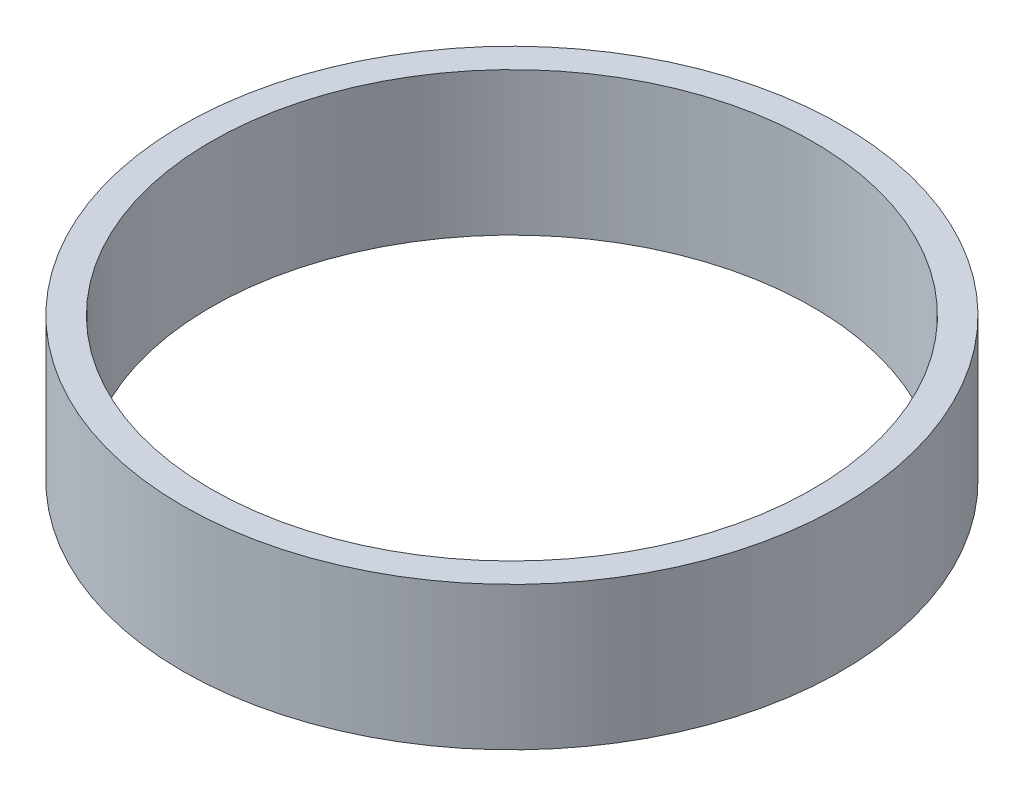
ISO-10303-21;
HEADER;
FILE_DESCRIPTION(('STEP AP214'),'2;1');
FILE_NAME('part.step','',(''),(''),'','','');
FILE_SCHEMA(('AUTOMOTIVE_DESIGN { 1 0 10303 214 1 1 1 1 }'));
ENDSEC;
DATA;
#1=APPLICATION_CONTEXT('core data for automotive mechanical design processes');
#2=APPLICATION_PROTOCOL_DEFINITION('international standard','automotive_design',2000,#1);
#3=PRODUCT_CONTEXT('',#1,'mechanical');
#4=PRODUCT('Part','Part','',(#3));
#5=PRODUCT_RELATED_PRODUCT_CATEGORY('part','',(#4));
#6=PRODUCT_DEFINITION_FORMATION('','',#4);
#7=PRODUCT_DEFINITION_CONTEXT('part definition',#1,'design');
#8=PRODUCT_DEFINITION('design','',#6,#7);
#9=PRODUCT_DEFINITION_SHAPE('','',#8);
#10=(LENGTH_UNIT() NAMED_UNIT(*) SI_UNIT(.MILLI.,.METRE.));
#11=(NAMED_UNIT(*) PLANE_ANGLE_UNIT() SI_UNIT($,.RADIAN.));
#12=(NAMED_UNIT(*) SI_UNIT($,.STERADIAN.) SOLID_ANGLE_UNIT());
#13=UNCERTAINTY_MEASURE_WITH_UNIT(LENGTH_MEASURE(1.E-05),#10,'distance_accuracy_value','');
#14=(GEOMETRIC_REPRESENTATION_CONTEXT(3) GLOBAL_UNCERTAINTY_ASSIGNED_CONTEXT((#13)) GLOBAL_UNIT_ASSIGNED_CONTEXT((#10,
#11,#12)) REPRESENTATION_CONTEXT('',''));
#15=CARTESIAN_POINT('',(0.,0.,0.));
#16=DIRECTION('',(0.,0.,1.));
#17=DIRECTION('',(1.,0.,0.));
#18=AXIS2_PLACEMENT_3D('',#15,#16,#17);
#19=CARTESIAN_POINT('',(0.,10.,0.));
#20=DIRECTION('',(0.,1.,0.));
#21=DIRECTION('',(0.,0.,1.));
#22=AXIS2_PLACEMENT_3D('',#19,#20,#21);
#23=PLANE('',#22);
#24=CARTESIAN_POINT('',(0.,10.,0.));
#25=DIRECTION('',(0.,1.,0.));
#26=DIRECTION('',(0.,0.,1.));
#27=AXIS2_PLACEMENT_3D('',#24,#25,#26);
#28=CIRCLE('',#27,23.);
#29=CARTESIAN_POINT('',(0.,10.,23.));
#30=VERTEX_POINT('',#29);
#31=EDGE_CURVE('E10',#30,#30,#28,.T.);
#32=ORIENTED_EDGE('',*,*,#31,.T.);
#33=EDGE_LOOP('',(#32));
#34=FACE_BOUND('',#33,.T.);
#35=CARTESIAN_POINT('',(0.,10.,0.));
#36=DIRECTION('',(0.,1.,0.));
#37=DIRECTION('',(0.,0.,1.));
#38=AXIS2_PLACEMENT_3D('',#35,#36,#37);
#39=CIRCLE('',#38,21.);
#40=CARTESIAN_POINT('',(0.,10.,21.));
#41=VERTEX_POINT('',#40);
#42=EDGE_CURVE('E42',#41,#41,#39,.T.);
#43=ORIENTED_EDGE('',*,*,#42,.F.);
#44=EDGE_LOOP('',(#43));
#45=FACE_BOUND('',#44,.T.);
#46=ADVANCED_FACE('F31',(#34,#45),#23,.T.);
#47=CARTESIAN_POINT('',(0.,0.,0.));
#48=DIRECTION('',(0.,1.,0.));
#49=DIRECTION('',(0.,0.,1.));
#50=AXIS2_PLACEMENT_3D('',#47,#48,#49);
#51=PLANE('',#50);
#52=CARTESIAN_POINT('',(0.,0.,0.));
#53=DIRECTION('',(0.,1.,0.));
#54=DIRECTION('',(0.,0.,1.));
#55=AXIS2_PLACEMENT_3D('',#52,#53,#54);
#56=CIRCLE('',#55,23.);
#57=CARTESIAN_POINT('',(0.,0.,23.));
#58=VERTEX_POINT('',#57);
#59=EDGE_CURVE('E35',#58,#58,#56,.T.);
#60=ORIENTED_EDGE('',*,*,#59,.F.);
#61=EDGE_LOOP('',(#60));
#62=FACE_BOUND('',#61,.T.);
#63=CARTESIAN_POINT('',(0.,0.,0.));
#64=DIRECTION('',(0.,1.,0.));
#65=DIRECTION('',(0.,0.,1.));
#66=AXIS2_PLACEMENT_3D('',#63,#64,#65);
#67=CIRCLE('',#66,21.);
#68=CARTESIAN_POINT('',(0.,0.,21.));
#69=VERTEX_POINT('',#68);
#70=EDGE_CURVE('E44',#69,#69,#67,.T.);
#71=ORIENTED_EDGE('',*,*,#70,.T.);
#72=EDGE_LOOP('',(#71));
#73=FACE_BOUND('',#72,.T.);
#74=ADVANCED_FACE('F54',(#62,#73),#51,.F.);
#75=CARTESIAN_POINT('',(0.,10.,0.));
#76=DIRECTION('',(0.,-1.,0.));
#77=DIRECTION('',(0.,0.,-1.));
#78=AXIS2_PLACEMENT_3D('',#75,#76,#77);
#79=CYLINDRICAL_SURFACE('',#78,23.);
#80=ORIENTED_EDGE('',*,*,#31,.F.);
#81=EDGE_LOOP('',(#80));
#82=FACE_BOUND('',#81,.T.);
#83=ORIENTED_EDGE('',*,*,#59,.T.);
#84=EDGE_LOOP('',(#83));
#85=FACE_BOUND('',#84,.T.);
#86=ADVANCED_FACE('F33',(#82,#85),#79,.T.);
#87=CARTESIAN_POINT('',(0.,10.,0.));
#88=DIRECTION('',(0.,-1.,0.));
#89=DIRECTION('',(0.,0.,-1.));
#90=AXIS2_PLACEMENT_3D('',#87,#88,#89);
#91=CYLINDRICAL_SURFACE('',#90,21.);
#92=ORIENTED_EDGE('',*,*,#42,.T.);
#93=EDGE_LOOP('',(#92));
#94=FACE_BOUND('',#93,.T.);
#95=ORIENTED_EDGE('',*,*,#70,.F.);
#96=EDGE_LOOP('',(#95));
#97=FACE_BOUND('',#96,.T.);
#98=ADVANCED_FACE('F50',(#94,#97),#91,.F.);
#99=CLOSED_SHELL('',(#46,#74,#86,#98));
#100=MANIFOLD_SOLID_BREP('B2',#99);
#101=ADVANCED_BREP_SHAPE_REPRESENTATION('',(#18,#100),#14);
#102=SHAPE_DEFINITION_REPRESENTATION(#9,#101);
ENDSEC;
END-ISO-10303-21;
